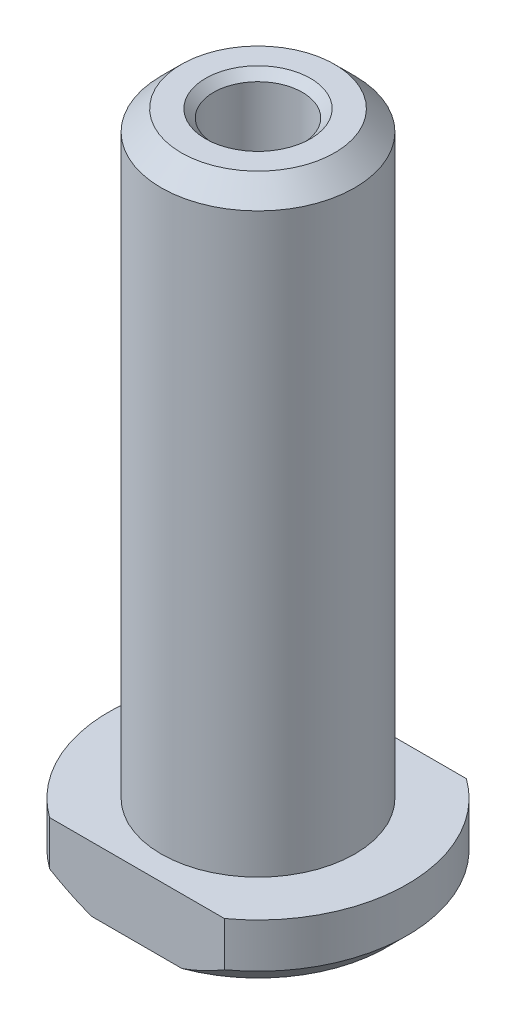
ISO-10303-21;
HEADER;
FILE_DESCRIPTION(('STEP AP214'),'2;1');
FILE_NAME('part.step','',(''),(''),'','','');
FILE_SCHEMA(('AUTOMOTIVE_DESIGN { 1 0 10303 214 1 1 1 1 }'));
ENDSEC;
DATA;
#1=APPLICATION_CONTEXT('core data for automotive mechanical design processes');
#2=APPLICATION_PROTOCOL_DEFINITION('international standard','automotive_design',2000,#1);
#3=PRODUCT_CONTEXT('',#1,'mechanical');
#4=PRODUCT('Part','Part','',(#3));
#5=PRODUCT_RELATED_PRODUCT_CATEGORY('part','',(#4));
#6=PRODUCT_DEFINITION_FORMATION('','',#4);
#7=PRODUCT_DEFINITION_CONTEXT('part definition',#1,'design');
#8=PRODUCT_DEFINITION('design','',#6,#7);
#9=PRODUCT_DEFINITION_SHAPE('','',#8);
#10=(LENGTH_UNIT() NAMED_UNIT(*) SI_UNIT(.MILLI.,.METRE.));
#11=(NAMED_UNIT(*) PLANE_ANGLE_UNIT() SI_UNIT($,.RADIAN.));
#12=(NAMED_UNIT(*) SI_UNIT($,.STERADIAN.) SOLID_ANGLE_UNIT());
#13=UNCERTAINTY_MEASURE_WITH_UNIT(LENGTH_MEASURE(1.E-05),#10,'distance_accuracy_value','');
#14=(GEOMETRIC_REPRESENTATION_CONTEXT(3) GLOBAL_UNCERTAINTY_ASSIGNED_CONTEXT((#13)) GLOBAL_UNIT_ASSIGNED_CONTEXT((#10,
#11,#12)) REPRESENTATION_CONTEXT('',''));
#15=CARTESIAN_POINT('',(0.,0.,0.));
#16=DIRECTION('',(0.,0.,1.));
#17=DIRECTION('',(1.,0.,0.));
#18=AXIS2_PLACEMENT_3D('',#15,#16,#17);
#19=CARTESIAN_POINT('',(0.,-148.,0.));
#20=DIRECTION('',(0.,-1.,0.));
#21=DIRECTION('',(0.,0.,-1.));
#22=AXIS2_PLACEMENT_3D('',#19,#20,#21);
#23=CYLINDRICAL_SURFACE('',#22,37.);
#24=DIRECTION('',(0.,-1.,0.));
#25=VECTOR('',#24,1.);
#26=CARTESIAN_POINT('',(21.6564078277077,-148.,30.));
#27=LINE('',#26,#25);
#28=CARTESIAN_POINT('',(21.6564078277077,-148.,30.));
#29=VERTEX_POINT('',#28);
#30=CARTESIAN_POINT('',(21.6564078277077,-159.,30.));
#31=VERTEX_POINT('',#30);
#32=EDGE_CURVE('E122',#29,#31,#27,.T.);
#33=ORIENTED_EDGE('',*,*,#32,.T.);
#34=CARTESIAN_POINT('',(0.,-159.,0.));
#35=DIRECTION('',(0.,-1.,0.));
#36=DIRECTION('',(0.,0.,-1.));
#37=AXIS2_PLACEMENT_3D('',#34,#35,#36);
#38=CIRCLE('',#37,37.);
#39=CARTESIAN_POINT('',(21.6564078277077,-159.,-30.));
#40=VERTEX_POINT('',#39);
#41=EDGE_CURVE('E56',#31,#40,#38,.F.);
#42=ORIENTED_EDGE('',*,*,#41,.T.);
#43=DIRECTION('',(0.,-1.,0.));
#44=VECTOR('',#43,1.);
#45=CARTESIAN_POINT('',(21.6564078277077,-148.,-30.));
#46=LINE('',#45,#44);
#47=CARTESIAN_POINT('',(21.6564078277077,-148.,-30.));
#48=VERTEX_POINT('',#47);
#49=EDGE_CURVE('E127',#48,#40,#46,.T.);
#50=ORIENTED_EDGE('',*,*,#49,.F.);
#51=CARTESIAN_POINT('',(0.,-148.,0.));
#52=DIRECTION('',(0.,-1.,0.));
#53=DIRECTION('',(0.,0.,-1.));
#54=AXIS2_PLACEMENT_3D('',#51,#52,#53);
#55=CIRCLE('',#54,37.);
#56=EDGE_CURVE('E109',#48,#29,#55,.T.);
#57=ORIENTED_EDGE('',*,*,#56,.T.);
#58=EDGE_LOOP('',(#33,#42,#50,#57));
#59=FACE_BOUND('',#58,.T.);
#60=ADVANCED_FACE('F33',(#59),#23,.T.);
#61=CARTESIAN_POINT('',(-21.6564078277077,-148.,-30.));
#62=DIRECTION('',(0.,0.,-1.));
#63=DIRECTION('',(-1.,0.,0.));
#64=AXIS2_PLACEMENT_3D('',#61,#62,#63);
#65=PLANE('',#64);
#66=ORIENTED_EDGE('',*,*,#49,.T.);
#67=CARTESIAN_POINT('',(21.6564078277077,-159.,-30.));
#68=CARTESIAN_POINT('',(21.2365323221884,-159.245741336174,-30.));
#69=CARTESIAN_POINT('',(20.8146100629257,-159.488012014773,-30.));
#70=CARTESIAN_POINT('',(19.9663834823541,-159.964834805485,-30.));
#71=CARTESIAN_POINT('',(19.5400788027682,-160.199386279836,-30.));
#72=CARTESIAN_POINT('',(18.6838747964629,-160.659411679915,-30.));
#73=CARTESIAN_POINT('',(18.2539862665107,-160.88490563556,-30.));
#74=CARTESIAN_POINT('',(17.3894170449389,-161.326469219497,-30.));
#75=CARTESIAN_POINT('',(16.9547363877844,-161.542538915513,-30.));
#76=CARTESIAN_POINT('',(15.6426134589133,-162.175400808785,-30.));
#77=CARTESIAN_POINT('',(14.7575093986768,-162.576618444368,-30.));
#78=CARTESIAN_POINT('',(13.4128461254362,-163.140623967096,-30.));
#79=CARTESIAN_POINT('',(12.9612476287199,-163.322514497207,-30.));
#80=CARTESIAN_POINT('',(12.0525316142175,-163.672184549557,-30.));
#81=CARTESIAN_POINT('',(11.5954130934625,-163.839961461905,-30.));
#82=CARTESIAN_POINT('',(11.1355287256601,-164.,-30.));
#83=B_SPLINE_CURVE_WITH_KNOTS('',3,(#67,#68,#69,#70,#71,#72,#73,#74,#75,#76,#77,#78,#79,#80,#81,
#82),.UNSPECIFIED.,.F.,.F.,(4,2,2,2,2,2,2,4),(0.,1.45950788031436,2.91913604436146,
4.37533536541546,5.83152422029276,8.74533132431449,10.2056848101492,11.6663077535976),.UNSPECIFIED.);
#84=CARTESIAN_POINT('',(11.1355287256601,-164.,-30.));
#85=VERTEX_POINT('',#84);
#86=EDGE_CURVE('E177',#40,#85,#83,.T.);
#87=ORIENTED_EDGE('',*,*,#86,.T.);
#88=DIRECTION('',(1.,0.,0.));
#89=VECTOR('',#88,1.);
#90=CARTESIAN_POINT('',(-21.6564078277077,-164.,-30.));
#91=LINE('',#90,#89);
#92=CARTESIAN_POINT('',(-11.1355287256601,-164.,-30.));
#93=VERTEX_POINT('',#92);
#94=EDGE_CURVE('E113',#93,#85,#91,.T.);
#95=ORIENTED_EDGE('',*,*,#94,.F.);
#96=CARTESIAN_POINT('',(-11.1355287256601,-164.,-30.));
#97=CARTESIAN_POINT('',(-11.5954130934626,-163.839961461905,-30.));
#98=CARTESIAN_POINT('',(-12.0525316142175,-163.672184549557,-30.));
#99=CARTESIAN_POINT('',(-12.9612476287199,-163.322514497207,-30.));
#100=CARTESIAN_POINT('',(-13.4128461254362,-163.140623967096,-30.));
#101=CARTESIAN_POINT('',(-14.7575093986767,-162.576618444368,-30.));
#102=CARTESIAN_POINT('',(-15.6426134589133,-162.175400808785,-30.));
#103=CARTESIAN_POINT('',(-16.9547363877844,-161.542538915513,-30.));
#104=CARTESIAN_POINT('',(-17.3894170449389,-161.326469219497,-30.));
#105=CARTESIAN_POINT('',(-18.2539862665107,-160.88490563556,-30.));
#106=CARTESIAN_POINT('',(-18.6838747964629,-160.659411679915,-30.));
#107=CARTESIAN_POINT('',(-19.5400788027682,-160.199386279836,-30.));
#108=CARTESIAN_POINT('',(-19.9663834823541,-159.964834805485,-30.));
#109=CARTESIAN_POINT('',(-20.8146100629257,-159.488012014773,-30.));
#110=CARTESIAN_POINT('',(-21.2365323221884,-159.245741336174,-30.));
#111=CARTESIAN_POINT('',(-21.6564078277077,-159.,-30.));
#112=B_SPLINE_CURVE_WITH_KNOTS('',3,(#96,#97,#98,#99,#100,#101,#102,#103,#104,#105,#106,#107,
#108,#109,#110,#111),.UNSPECIFIED.,.F.,.F.,(4,2,2,2,2,2,2,4),(0.,1.46062294344841,
2.9209764292831,5.83478353330485,7.29097238818219,8.74717170923616,10.2067998732833,
11.6663077535976),.UNSPECIFIED.);
#113=CARTESIAN_POINT('',(-21.6564078277077,-159.,-30.));
#114=VERTEX_POINT('',#113);
#115=EDGE_CURVE('E48',#93,#114,#112,.T.);
#116=ORIENTED_EDGE('',*,*,#115,.T.);
#117=DIRECTION('',(0.,-1.,0.));
#118=VECTOR('',#117,1.);
#119=CARTESIAN_POINT('',(-21.6564078277077,-148.,-30.));
#120=LINE('',#119,#118);
#121=CARTESIAN_POINT('',(-21.6564078277077,-148.,-30.));
#122=VERTEX_POINT('',#121);
#123=EDGE_CURVE('E130',#122,#114,#120,.T.);
#124=ORIENTED_EDGE('',*,*,#123,.F.);
#125=DIRECTION('',(1.,0.,0.));
#126=VECTOR('',#125,1.);
#127=CARTESIAN_POINT('',(-21.6564078277077,-148.,-30.));
#128=LINE('',#127,#126);
#129=EDGE_CURVE('E119',#122,#48,#128,.T.);
#130=ORIENTED_EDGE('',*,*,#129,.T.);
#131=EDGE_LOOP('',(#66,#87,#95,#116,#124,#130));
#132=FACE_BOUND('',#131,.T.);
#133=ADVANCED_FACE('F182',(#132),#65,.T.);
#134=CARTESIAN_POINT('',(0.,-148.,0.));
#135=DIRECTION('',(0.,-1.,0.));
#136=DIRECTION('',(0.,0.,-1.));
#137=AXIS2_PLACEMENT_3D('',#134,#135,#136);
#138=CYLINDRICAL_SURFACE('',#137,37.);
#139=ORIENTED_EDGE('',*,*,#123,.T.);
#140=CARTESIAN_POINT('',(0.,-159.,0.));
#141=DIRECTION('',(0.,-1.,0.));
#142=DIRECTION('',(0.,0.,-1.));
#143=AXIS2_PLACEMENT_3D('',#140,#141,#142);
#144=CIRCLE('',#143,37.);
#145=CARTESIAN_POINT('',(-21.6564078277077,-159.,30.));
#146=VERTEX_POINT('',#145);
#147=EDGE_CURVE('E243',#114,#146,#144,.F.);
#148=ORIENTED_EDGE('',*,*,#147,.T.);
#149=DIRECTION('',(0.,-1.,0.));
#150=VECTOR('',#149,1.);
#151=CARTESIAN_POINT('',(-21.6564078277077,-148.,30.));
#152=LINE('',#151,#150);
#153=CARTESIAN_POINT('',(-21.6564078277077,-148.,30.));
#154=VERTEX_POINT('',#153);
#155=EDGE_CURVE('E132',#154,#146,#152,.T.);
#156=ORIENTED_EDGE('',*,*,#155,.F.);
#157=CARTESIAN_POINT('',(0.,-148.,0.));
#158=DIRECTION('',(0.,-1.,0.));
#159=DIRECTION('',(0.,0.,-1.));
#160=AXIS2_PLACEMENT_3D('',#157,#158,#159);
#161=CIRCLE('',#160,37.);
#162=EDGE_CURVE('E116',#154,#122,#161,.T.);
#163=ORIENTED_EDGE('',*,*,#162,.T.);
#164=EDGE_LOOP('',(#139,#148,#156,#163));
#165=FACE_BOUND('',#164,.T.);
#166=ADVANCED_FACE('F186',(#165),#138,.T.);
#167=CARTESIAN_POINT('',(21.6564078277077,-148.,30.));
#168=DIRECTION('',(0.,0.,1.));
#169=DIRECTION('',(1.,0.,0.));
#170=AXIS2_PLACEMENT_3D('',#167,#168,#169);
#171=PLANE('',#170);
#172=DIRECTION('',(-1.,0.,0.));
#173=VECTOR('',#172,1.);
#174=CARTESIAN_POINT('',(21.6564078277077,-164.,30.));
#175=LINE('',#174,#173);
#176=CARTESIAN_POINT('',(11.1355287256601,-164.,30.));
#177=VERTEX_POINT('',#176);
#178=CARTESIAN_POINT('',(-11.1355287256601,-164.,30.));
#179=VERTEX_POINT('',#178);
#180=EDGE_CURVE('E102',#177,#179,#175,.T.);
#181=ORIENTED_EDGE('',*,*,#180,.F.);
#182=CARTESIAN_POINT('',(11.1355287256601,-164.,30.));
#183=CARTESIAN_POINT('',(11.5954130934626,-163.839961461905,30.));
#184=CARTESIAN_POINT('',(12.0525316142175,-163.672184549557,30.));
#185=CARTESIAN_POINT('',(12.9612476287199,-163.322514497207,30.));
#186=CARTESIAN_POINT('',(13.4128461254362,-163.140623967096,30.));
#187=CARTESIAN_POINT('',(14.7575093986768,-162.576618444368,30.));
#188=CARTESIAN_POINT('',(15.6426134589133,-162.175400808785,30.));
#189=CARTESIAN_POINT('',(16.9547363877844,-161.542538915513,30.));
#190=CARTESIAN_POINT('',(17.3894170449389,-161.326469219497,30.));
#191=CARTESIAN_POINT('',(18.2539862665107,-160.88490563556,30.));
#192=CARTESIAN_POINT('',(18.6838747964629,-160.659411679915,30.));
#193=CARTESIAN_POINT('',(19.5400788027682,-160.199386279836,30.));
#194=CARTESIAN_POINT('',(19.9663834823541,-159.964834805485,30.));
#195=CARTESIAN_POINT('',(20.8146100629257,-159.488012014773,30.));
#196=CARTESIAN_POINT('',(21.2365323221884,-159.245741336174,30.));
#197=CARTESIAN_POINT('',(21.6564078277077,-159.,30.));
#198=B_SPLINE_CURVE_WITH_KNOTS('',3,(#182,#183,#184,#185,#186,#187,#188,#189,#190,#191,#192,
#193,#194,#195,#196,#197),.UNSPECIFIED.,.F.,.F.,(4,2,2,2,2,2,2,4),(0.,1.46062294344841,
2.9209764292831,5.83478353330485,7.29097238818218,8.74717170923615,10.2067998732832,
11.6663077535976),.UNSPECIFIED.);
#199=EDGE_CURVE('E153',#177,#31,#198,.T.);
#200=ORIENTED_EDGE('',*,*,#199,.T.);
#201=ORIENTED_EDGE('',*,*,#32,.F.);
#202=DIRECTION('',(-1.,0.,0.));
#203=VECTOR('',#202,1.);
#204=CARTESIAN_POINT('',(21.6564078277077,-148.,30.));
#205=LINE('',#204,#203);
#206=EDGE_CURVE('E112',#29,#154,#205,.T.);
#207=ORIENTED_EDGE('',*,*,#206,.T.);
#208=ORIENTED_EDGE('',*,*,#155,.T.);
#209=CARTESIAN_POINT('',(-21.6564078277077,-159.,30.));
#210=CARTESIAN_POINT('',(-21.2365323221884,-159.245741336174,30.));
#211=CARTESIAN_POINT('',(-20.8146100629257,-159.488012014773,30.));
#212=CARTESIAN_POINT('',(-19.9663834823541,-159.964834805485,30.));
#213=CARTESIAN_POINT('',(-19.5400788027682,-160.199386279836,30.));
#214=CARTESIAN_POINT('',(-18.683874796463,-160.659411679915,30.));
#215=CARTESIAN_POINT('',(-18.2539862665107,-160.88490563556,30.));
#216=CARTESIAN_POINT('',(-17.389417044939,-161.326469219497,30.));
#217=CARTESIAN_POINT('',(-16.9547363877844,-161.542538915513,30.));
#218=CARTESIAN_POINT('',(-15.6426134589133,-162.175400808785,30.));
#219=CARTESIAN_POINT('',(-14.7575093986768,-162.576618444368,30.));
#220=CARTESIAN_POINT('',(-13.4128461254362,-163.140623967096,30.));
#221=CARTESIAN_POINT('',(-12.9612476287199,-163.322514497207,30.));
#222=CARTESIAN_POINT('',(-12.0525316142175,-163.672184549557,30.));
#223=CARTESIAN_POINT('',(-11.5954130934626,-163.839961461905,30.));
#224=CARTESIAN_POINT('',(-11.1355287256602,-164.,30.));
#225=B_SPLINE_CURVE_WITH_KNOTS('',3,(#209,#210,#211,#212,#213,#214,#215,#216,#217,#218,#219,
#220,#221,#222,#223,#224),.UNSPECIFIED.,.F.,.F.,(4,2,2,2,2,2,2,4),(0.,1.45950788031436,
2.91913604436145,4.37533536541541,5.83152422029275,8.74533132431447,10.2056848101492,
11.6663077535976),.UNSPECIFIED.);
#226=EDGE_CURVE('E147',#146,#179,#225,.T.);
#227=ORIENTED_EDGE('',*,*,#226,.T.);
#228=EDGE_LOOP('',(#181,#200,#201,#207,#208,#227));
#229=FACE_BOUND('',#228,.T.);
#230=ADVANCED_FACE('F159',(#229),#171,.T.);
#231=CARTESIAN_POINT('',(0.,-148.,0.));
#232=DIRECTION('',(0.,-1.,0.));
#233=DIRECTION('',(0.,0.,-1.));
#234=AXIS2_PLACEMENT_3D('',#231,#232,#233);
#235=PLANE('',#234);
#236=CARTESIAN_POINT('',(0.,-148.,0.));
#237=DIRECTION('',(0.,1.,0.));
#238=DIRECTION('',(0.,0.,1.));
#239=AXIS2_PLACEMENT_3D('',#236,#237,#238);
#240=CIRCLE('',#239,24.);
#241=CARTESIAN_POINT('',(0.,-148.,24.));
#242=VERTEX_POINT('',#241);
#243=EDGE_CURVE('E98',#242,#242,#240,.T.);
#244=ORIENTED_EDGE('',*,*,#243,.F.);
#245=EDGE_LOOP('',(#244));
#246=FACE_BOUND('',#245,.T.);
#247=ORIENTED_EDGE('',*,*,#56,.F.);
#248=ORIENTED_EDGE('',*,*,#129,.F.);
#249=ORIENTED_EDGE('',*,*,#162,.F.);
#250=ORIENTED_EDGE('',*,*,#206,.F.);
#251=EDGE_LOOP('',(#247,#248,#249,#250));
#252=FACE_BOUND('',#251,.T.);
#253=ADVANCED_FACE('F195',(#246,#252),#235,.F.);
#254=CARTESIAN_POINT('',(0.,-164.,0.));
#255=DIRECTION('',(0.,-1.,0.));
#256=DIRECTION('',(0.,0.,-1.));
#257=AXIS2_PLACEMENT_3D('',#254,#255,#256);
#258=PLANE('',#257);
#259=ORIENTED_EDGE('',*,*,#94,.T.);
#260=CARTESIAN_POINT('',(0.,-164.,0.));
#261=DIRECTION('',(0.,-1.,0.));
#262=DIRECTION('',(0.,0.,-1.));
#263=AXIS2_PLACEMENT_3D('',#260,#261,#262);
#264=CIRCLE('',#263,32.);
#265=EDGE_CURVE('E144',#85,#177,#264,.T.);
#266=ORIENTED_EDGE('',*,*,#265,.T.);
#267=ORIENTED_EDGE('',*,*,#180,.T.);
#268=CARTESIAN_POINT('',(0.,-164.,0.));
#269=DIRECTION('',(0.,-1.,0.));
#270=DIRECTION('',(0.,0.,-1.));
#271=AXIS2_PLACEMENT_3D('',#268,#269,#270);
#272=CIRCLE('',#271,32.);
#273=EDGE_CURVE('E141',#179,#93,#272,.T.);
#274=ORIENTED_EDGE('',*,*,#273,.T.);
#275=EDGE_LOOP('',(#259,#266,#267,#274));
#276=FACE_BOUND('',#275,.T.);
#277=ADVANCED_FACE('F187',(#276),#258,.T.);
#278=CARTESIAN_POINT('',(0.,-148.,0.));
#279=DIRECTION('',(0.,1.,0.));
#280=DIRECTION('',(0.,0.,1.));
#281=AXIS2_PLACEMENT_3D('',#278,#279,#280);
#282=CYLINDRICAL_SURFACE('',#281,24.);
#283=CARTESIAN_POINT('',(0.,-4.99999999999998,0.));
#284=DIRECTION('',(0.,1.,0.));
#285=DIRECTION('',(0.,0.,1.));
#286=AXIS2_PLACEMENT_3D('',#283,#284,#285);
#287=CIRCLE('',#286,24.);
#288=CARTESIAN_POINT('',(0.,-4.99999999999998,24.));
#289=VERTEX_POINT('',#288);
#290=EDGE_CURVE('E138',#289,#289,#287,.F.);
#291=ORIENTED_EDGE('',*,*,#290,.T.);
#292=EDGE_LOOP('',(#291));
#293=FACE_BOUND('',#292,.T.);
#294=ORIENTED_EDGE('',*,*,#243,.T.);
#295=EDGE_LOOP('',(#294));
#296=FACE_BOUND('',#295,.T.);
#297=ADVANCED_FACE('F217',(#293,#296),#282,.T.);
#298=CARTESIAN_POINT('',(0.,0.,0.));
#299=DIRECTION('',(0.,1.,0.));
#300=DIRECTION('',(0.,0.,1.));
#301=AXIS2_PLACEMENT_3D('',#298,#299,#300);
#302=PLANE('',#301);
#303=CARTESIAN_POINT('',(0.,0.,0.));
#304=DIRECTION('',(0.,1.,0.));
#305=DIRECTION('',(0.,0.,1.));
#306=AXIS2_PLACEMENT_3D('',#303,#304,#305);
#307=CIRCLE('',#306,13.);
#308=CARTESIAN_POINT('',(0.,0.,13.));
#309=VERTEX_POINT('',#308);
#310=EDGE_CURVE('E11',#309,#309,#307,.F.);
#311=ORIENTED_EDGE('',*,*,#310,.T.);
#312=EDGE_LOOP('',(#311));
#313=FACE_BOUND('',#312,.T.);
#314=CARTESIAN_POINT('',(0.,0.,0.));
#315=DIRECTION('',(0.,1.,0.));
#316=DIRECTION('',(0.,0.,1.));
#317=AXIS2_PLACEMENT_3D('',#314,#315,#316);
#318=CIRCLE('',#317,19.);
#319=CARTESIAN_POINT('',(0.,0.,19.));
#320=VERTEX_POINT('',#319);
#321=EDGE_CURVE('E129',#320,#320,#318,.T.);
#322=ORIENTED_EDGE('',*,*,#321,.T.);
#323=EDGE_LOOP('',(#322));
#324=FACE_BOUND('',#323,.T.);
#325=ADVANCED_FACE('F92',(#313,#324),#302,.T.);
#326=CARTESIAN_POINT('',(0.,-115.,0.));
#327=DIRECTION('',(0.,1.,0.));
#328=DIRECTION('',(0.,0.,1.));
#329=AXIS2_PLACEMENT_3D('',#326,#327,#328);
#330=CONICAL_SURFACE('',#329,16.,1.0471975511966);
#331=CARTESIAN_POINT('',(0.,-124.237604307034,0.));
#332=VERTEX_POINT('',#331);
#333=VERTEX_LOOP('',#332);
#334=FACE_BOUND('',#333,.T.);
#335=CARTESIAN_POINT('',(0.,-115.,0.));
#336=DIRECTION('',(0.,1.,0.));
#337=DIRECTION('',(0.,0.,1.));
#338=AXIS2_PLACEMENT_3D('',#335,#336,#337);
#339=CIRCLE('',#338,16.);
#340=CARTESIAN_POINT('',(0.,-115.,16.));
#341=VERTEX_POINT('',#340);
#342=EDGE_CURVE('E96',#341,#341,#339,.T.);
#343=ORIENTED_EDGE('',*,*,#342,.T.);
#344=EDGE_LOOP('',(#343));
#345=FACE_BOUND('',#344,.T.);
#346=ADVANCED_FACE('F88',(#334,#345),#330,.F.);
#347=CARTESIAN_POINT('',(0.,0.,0.));
#348=DIRECTION('',(0.,1.,0.));
#349=DIRECTION('',(0.,0.,1.));
#350=AXIS2_PLACEMENT_3D('',#347,#348,#349);
#351=CYLINDRICAL_SURFACE('',#350,16.);
#352=ORIENTED_EDGE('',*,*,#342,.F.);
#353=EDGE_LOOP('',(#352));
#354=FACE_BOUND('',#353,.T.);
#355=CARTESIAN_POINT('',(0.,-65.,0.));
#356=DIRECTION('',(0.,1.,0.));
#357=DIRECTION('',(0.,0.,1.));
#358=AXIS2_PLACEMENT_3D('',#355,#356,#357);
#359=CIRCLE('',#358,16.);
#360=CARTESIAN_POINT('',(0.,-65.,16.));
#361=VERTEX_POINT('',#360);
#362=EDGE_CURVE('E99',#361,#361,#359,.T.);
#363=ORIENTED_EDGE('',*,*,#362,.T.);
#364=EDGE_LOOP('',(#363));
#365=FACE_BOUND('',#364,.T.);
#366=ADVANCED_FACE('F91',(#354,#365),#351,.F.);
#367=CARTESIAN_POINT('',(16.,-65.,0.));
#368=DIRECTION('',(0.,1.,0.));
#369=DIRECTION('',(0.,0.,1.));
#370=AXIS2_PLACEMENT_3D('',#367,#368,#369);
#371=PLANE('',#370);
#372=ORIENTED_EDGE('',*,*,#362,.F.);
#373=EDGE_LOOP('',(#372));
#374=FACE_BOUND('',#373,.T.);
#375=CARTESIAN_POINT('',(0.,-65.,0.));
#376=DIRECTION('',(0.,1.,0.));
#377=DIRECTION('',(0.,0.,1.));
#378=AXIS2_PLACEMENT_3D('',#375,#376,#377);
#379=CIRCLE('',#378,11.);
#380=CARTESIAN_POINT('',(0.,-65.,11.));
#381=VERTEX_POINT('',#380);
#382=EDGE_CURVE('E105',#381,#381,#379,.T.);
#383=ORIENTED_EDGE('',*,*,#382,.T.);
#384=EDGE_LOOP('',(#383));
#385=FACE_BOUND('',#384,.T.);
#386=ADVANCED_FACE('F209',(#374,#385),#371,.F.);
#387=CARTESIAN_POINT('',(0.,0.,0.));
#388=DIRECTION('',(0.,1.,0.));
#389=DIRECTION('',(0.,0.,1.));
#390=AXIS2_PLACEMENT_3D('',#387,#388,#389);
#391=CYLINDRICAL_SURFACE('',#390,11.);
#392=CARTESIAN_POINT('',(0.,-1.99999999999995,0.));
#393=DIRECTION('',(0.,1.,0.));
#394=DIRECTION('',(0.,0.,1.));
#395=AXIS2_PLACEMENT_3D('',#392,#393,#394);
#396=CIRCLE('',#395,11.);
#397=CARTESIAN_POINT('',(0.,-1.99999999999995,11.));
#398=VERTEX_POINT('',#397);
#399=EDGE_CURVE('E41',#398,#398,#396,.T.);
#400=ORIENTED_EDGE('',*,*,#399,.T.);
#401=EDGE_LOOP('',(#400));
#402=FACE_BOUND('',#401,.T.);
#403=ORIENTED_EDGE('',*,*,#382,.F.);
#404=EDGE_LOOP('',(#403));
#405=FACE_BOUND('',#404,.T.);
#406=ADVANCED_FACE('F202',(#402,#405),#391,.F.);
#407=CARTESIAN_POINT('',(0.,0.,0.));
#408=DIRECTION('',(0.,-1.,0.));
#409=DIRECTION('',(0.,0.,-1.));
#410=AXIS2_PLACEMENT_3D('',#407,#408,#409);
#411=CONICAL_SURFACE('',#410,19.,0.785398163397446);
#412=ORIENTED_EDGE('',*,*,#290,.F.);
#413=EDGE_LOOP('',(#412));
#414=FACE_BOUND('',#413,.T.);
#415=ORIENTED_EDGE('',*,*,#321,.F.);
#416=EDGE_LOOP('',(#415));
#417=FACE_BOUND('',#416,.T.);
#418=ADVANCED_FACE('F200',(#414,#417),#411,.T.);
#419=CARTESIAN_POINT('',(0.,-164.,0.));
#420=DIRECTION('',(0.,1.,0.));
#421=DIRECTION('',(0.,0.,1.));
#422=AXIS2_PLACEMENT_3D('',#419,#420,#421);
#423=CONICAL_SURFACE('',#422,32.,0.785398163397447);
#424=ORIENTED_EDGE('',*,*,#86,.F.);
#425=ORIENTED_EDGE('',*,*,#41,.F.);
#426=ORIENTED_EDGE('',*,*,#199,.F.);
#427=ORIENTED_EDGE('',*,*,#265,.F.);
#428=EDGE_LOOP('',(#424,#425,#426,#427));
#429=FACE_BOUND('',#428,.T.);
#430=ADVANCED_FACE('F166',(#429),#423,.T.);
#431=CARTESIAN_POINT('',(0.,-164.,0.));
#432=DIRECTION('',(0.,1.,0.));
#433=DIRECTION('',(0.,0.,1.));
#434=AXIS2_PLACEMENT_3D('',#431,#432,#433);
#435=CONICAL_SURFACE('',#434,32.,0.785398163397448);
#436=ORIENTED_EDGE('',*,*,#226,.F.);
#437=ORIENTED_EDGE('',*,*,#147,.F.);
#438=ORIENTED_EDGE('',*,*,#115,.F.);
#439=ORIENTED_EDGE('',*,*,#273,.F.);
#440=EDGE_LOOP('',(#436,#437,#438,#439));
#441=FACE_BOUND('',#440,.T.);
#442=ADVANCED_FACE('F163',(#441),#435,.T.);
#443=CARTESIAN_POINT('',(0.,-1.99999999999995,0.));
#444=DIRECTION('',(0.,1.,0.));
#445=DIRECTION('',(0.,0.,1.));
#446=AXIS2_PLACEMENT_3D('',#443,#444,#445);
#447=CONICAL_SURFACE('',#446,11.,0.78539816339745);
#448=ORIENTED_EDGE('',*,*,#310,.F.);
#449=EDGE_LOOP('',(#448));
#450=FACE_BOUND('',#449,.T.);
#451=ORIENTED_EDGE('',*,*,#399,.F.);
#452=EDGE_LOOP('',(#451));
#453=FACE_BOUND('',#452,.T.);
#454=ADVANCED_FACE('F35',(#450,#453),#447,.F.);
#455=CLOSED_SHELL('',(#60,#133,#166,#230,#253,#277,#297,#325,#346,#366,#386,#406,#418,#430,#442,#454));
#456=MANIFOLD_SOLID_BREP('B2',#455);
#457=ADVANCED_BREP_SHAPE_REPRESENTATION('',(#18,#456),#14);
#458=SHAPE_DEFINITION_REPRESENTATION(#9,#457);
ENDSEC;
END-ISO-10303-21;
